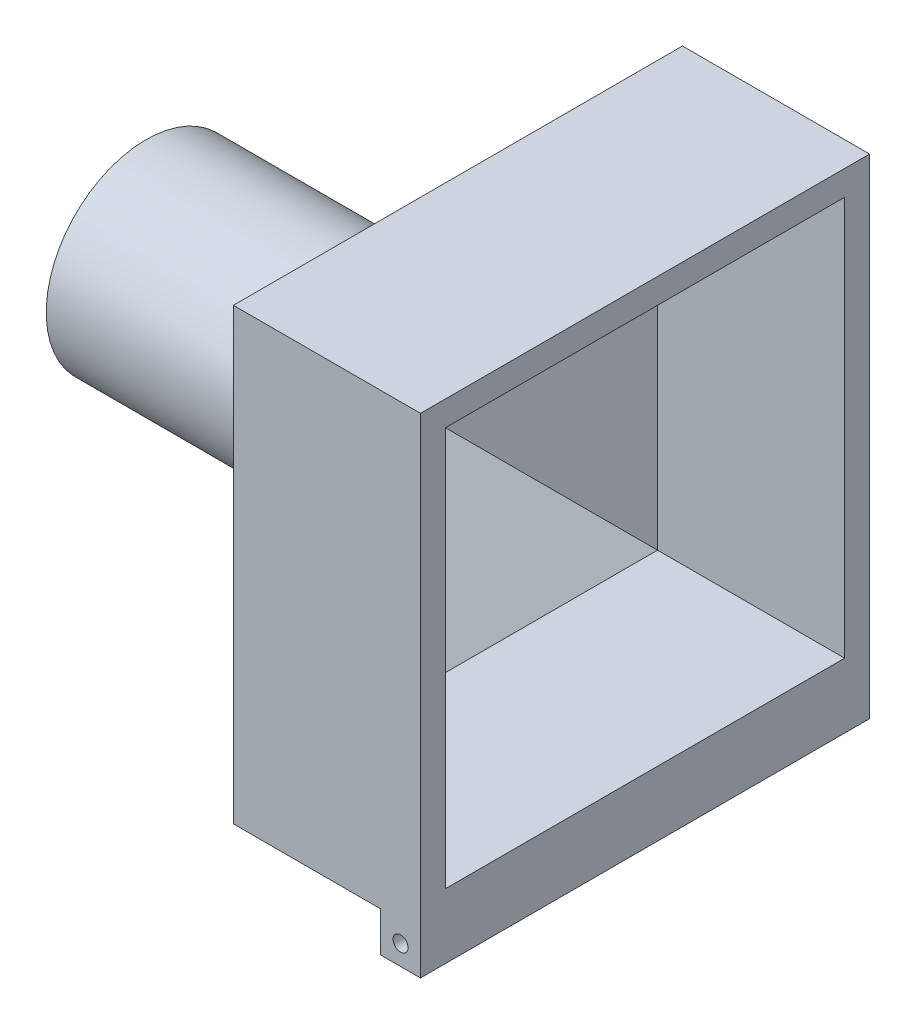
ISO-10303-21;
HEADER;
FILE_DESCRIPTION(('STEP AP214'),'2;1');
FILE_NAME('part.step','',(''),(''),'','','');
FILE_SCHEMA(('AUTOMOTIVE_DESIGN { 1 0 10303 214 1 1 1 1 }'));
ENDSEC;
DATA;
#1=APPLICATION_CONTEXT('core data for automotive mechanical design processes');
#2=APPLICATION_PROTOCOL_DEFINITION('international standard','automotive_design',2000,#1);
#3=PRODUCT_CONTEXT('',#1,'mechanical');
#4=PRODUCT('Part','Part','',(#3));
#5=PRODUCT_RELATED_PRODUCT_CATEGORY('part','',(#4));
#6=PRODUCT_DEFINITION_FORMATION('','',#4);
#7=PRODUCT_DEFINITION_CONTEXT('part definition',#1,'design');
#8=PRODUCT_DEFINITION('design','',#6,#7);
#9=PRODUCT_DEFINITION_SHAPE('','',#8);
#10=(LENGTH_UNIT() NAMED_UNIT(*) SI_UNIT(.MILLI.,.METRE.));
#11=(NAMED_UNIT(*) PLANE_ANGLE_UNIT() SI_UNIT($,.RADIAN.));
#12=(NAMED_UNIT(*) SI_UNIT($,.STERADIAN.) SOLID_ANGLE_UNIT());
#13=UNCERTAINTY_MEASURE_WITH_UNIT(LENGTH_MEASURE(1.E-05),#10,'distance_accuracy_value','');
#14=(GEOMETRIC_REPRESENTATION_CONTEXT(3) GLOBAL_UNCERTAINTY_ASSIGNED_CONTEXT((#13)) GLOBAL_UNIT_ASSIGNED_CONTEXT((#10,
#11,#12)) REPRESENTATION_CONTEXT('',''));
#15=CARTESIAN_POINT('',(0.,0.,0.));
#16=DIRECTION('',(0.,0.,1.));
#17=DIRECTION('',(1.,0.,0.));
#18=AXIS2_PLACEMENT_3D('',#15,#16,#17);
#19=CARTESIAN_POINT('',(40.,-18.,18.));
#20=DIRECTION('',(0.,1.,0.));
#21=DIRECTION('',(0.,0.,1.));
#22=AXIS2_PLACEMENT_3D('',#19,#20,#21);
#23=PLANE('',#22);
#24=DIRECTION('',(0.,0.,-1.));
#25=VECTOR('',#24,1.);
#26=CARTESIAN_POINT('',(36.8,-18.,18.));
#27=LINE('',#26,#25);
#28=CARTESIAN_POINT('',(36.8,-18.,18.));
#29=VERTEX_POINT('',#28);
#30=CARTESIAN_POINT('',(36.8,-18.,-18.));
#31=VERTEX_POINT('',#30);
#32=EDGE_CURVE('E51',#29,#31,#27,.T.);
#33=ORIENTED_EDGE('',*,*,#32,.F.);
#34=DIRECTION('',(-1.,0.,0.));
#35=VECTOR('',#34,1.);
#36=CARTESIAN_POINT('',(40.,-18.,18.));
#37=LINE('',#36,#35);
#38=CARTESIAN_POINT('',(25.,-18.,18.));
#39=VERTEX_POINT('',#38);
#40=EDGE_CURVE('E275',#29,#39,#37,.T.);
#41=ORIENTED_EDGE('',*,*,#40,.T.);
#42=DIRECTION('',(0.,0.,1.));
#43=VECTOR('',#42,1.);
#44=CARTESIAN_POINT('',(25.,-18.,0.));
#45=LINE('',#44,#43);
#46=CARTESIAN_POINT('',(25.,-18.,-18.));
#47=VERTEX_POINT('',#46);
#48=EDGE_CURVE('E309',#39,#47,#45,.F.);
#49=ORIENTED_EDGE('',*,*,#48,.T.);
#50=DIRECTION('',(-1.,0.,0.));
#51=VECTOR('',#50,1.);
#52=CARTESIAN_POINT('',(40.,-18.,-18.));
#53=LINE('',#52,#51);
#54=EDGE_CURVE('E273',#31,#47,#53,.T.);
#55=ORIENTED_EDGE('',*,*,#54,.F.);
#56=EDGE_LOOP('',(#33,#41,#49,#55));
#57=FACE_BOUND('',#56,.T.);
#58=ADVANCED_FACE('F35',(#57),#23,.F.);
#59=CARTESIAN_POINT('',(15.8,0.,0.));
#60=DIRECTION('',(-1.,0.,0.));
#61=DIRECTION('',(0.,0.,1.));
#62=AXIS2_PLACEMENT_3D('',#59,#60,#61);
#63=PLANE('',#62);
#64=DIRECTION('',(0.,-1.,0.));
#65=VECTOR('',#64,1.);
#66=CARTESIAN_POINT('',(15.8,-16.,6.8));
#67=LINE('',#66,#65);
#68=CARTESIAN_POINT('',(15.8,6.8,6.8));
#69=VERTEX_POINT('',#68);
#70=CARTESIAN_POINT('',(15.8,3.39411254969542,6.8));
#71=VERTEX_POINT('',#70);
#72=EDGE_CURVE('E231',#69,#71,#67,.T.);
#73=ORIENTED_EDGE('',*,*,#72,.T.);
#74=CARTESIAN_POINT('',(15.8,0.,0.));
#75=DIRECTION('',(-1.,0.,0.));
#76=DIRECTION('',(0.,0.,1.));
#77=AXIS2_PLACEMENT_3D('',#74,#75,#76);
#78=CIRCLE('',#77,7.6);
#79=CARTESIAN_POINT('',(15.8,6.8,3.39411254969542));
#80=VERTEX_POINT('',#79);
#81=EDGE_CURVE('E11',#71,#80,#78,.T.);
#82=ORIENTED_EDGE('',*,*,#81,.T.);
#83=DIRECTION('',(0.,0.,1.));
#84=VECTOR('',#83,1.);
#85=CARTESIAN_POINT('',(15.8,6.8,16.));
#86=LINE('',#85,#84);
#87=EDGE_CURVE('E227',#80,#69,#86,.T.);
#88=ORIENTED_EDGE('',*,*,#87,.T.);
#89=EDGE_LOOP('',(#73,#82,#88));
#90=FACE_BOUND('',#89,.T.);
#91=ADVANCED_FACE('F372',(#90),#63,.F.);
#92=CARTESIAN_POINT('',(15.8,6.8,-6.8));
#93=VERTEX_POINT('',#92);
#94=CARTESIAN_POINT('',(15.8,6.8,-3.39411254969542));
#95=VERTEX_POINT('',#94);
#96=EDGE_CURVE('E235',#93,#95,#86,.T.);
#97=ORIENTED_EDGE('',*,*,#96,.T.);
#98=CARTESIAN_POINT('',(15.8,3.39411254969542,-6.8));
#99=VERTEX_POINT('',#98);
#100=EDGE_CURVE('E44',#95,#99,#78,.T.);
#101=ORIENTED_EDGE('',*,*,#100,.T.);
#102=DIRECTION('',(0.,1.,0.));
#103=VECTOR('',#102,1.);
#104=CARTESIAN_POINT('',(15.8,-16.,-6.8));
#105=LINE('',#104,#103);
#106=EDGE_CURVE('E212',#99,#93,#105,.T.);
#107=ORIENTED_EDGE('',*,*,#106,.T.);
#108=EDGE_LOOP('',(#97,#101,#107));
#109=FACE_BOUND('',#108,.T.);
#110=ADVANCED_FACE('F377',(#109),#63,.F.);
#111=CARTESIAN_POINT('',(15.8,-6.8,-6.8));
#112=VERTEX_POINT('',#111);
#113=CARTESIAN_POINT('',(15.8,-3.39411254969542,-6.8));
#114=VERTEX_POINT('',#113);
#115=EDGE_CURVE('E224',#112,#114,#105,.T.);
#116=ORIENTED_EDGE('',*,*,#115,.T.);
#117=CARTESIAN_POINT('',(15.8,-6.8,-3.39411254969542));
#118=VERTEX_POINT('',#117);
#119=EDGE_CURVE('E654',#114,#118,#78,.T.);
#120=ORIENTED_EDGE('',*,*,#119,.T.);
#121=DIRECTION('',(0.,0.,-1.));
#122=VECTOR('',#121,1.);
#123=CARTESIAN_POINT('',(15.8,-6.8,16.));
#124=LINE('',#123,#122);
#125=EDGE_CURVE('E230',#118,#112,#124,.T.);
#126=ORIENTED_EDGE('',*,*,#125,.T.);
#127=EDGE_LOOP('',(#116,#120,#126));
#128=FACE_BOUND('',#127,.T.);
#129=ADVANCED_FACE('F369',(#128),#63,.F.);
#130=CARTESIAN_POINT('',(0.,0.,0.));
#131=DIRECTION('',(1.,0.,0.));
#132=DIRECTION('',(0.,0.,-1.));
#133=AXIS2_PLACEMENT_3D('',#130,#131,#132);
#134=PLANE('',#133);
#135=CARTESIAN_POINT('',(0.,0.,0.));
#136=DIRECTION('',(1.,0.,0.));
#137=DIRECTION('',(0.,0.,-1.));
#138=AXIS2_PLACEMENT_3D('',#135,#136,#137);
#139=CIRCLE('',#138,8.);
#140=CARTESIAN_POINT('',(0.,0.,-8.));
#141=VERTEX_POINT('',#140);
#142=EDGE_CURVE('E325',#141,#141,#139,.T.);
#143=ORIENTED_EDGE('',*,*,#142,.F.);
#144=EDGE_LOOP('',(#143));
#145=FACE_BOUND('',#144,.T.);
#146=CARTESIAN_POINT('',(0.,0.,0.));
#147=DIRECTION('',(1.,0.,0.));
#148=DIRECTION('',(0.,0.,-1.));
#149=AXIS2_PLACEMENT_3D('',#146,#147,#148);
#150=CIRCLE('',#149,7.6);
#151=CARTESIAN_POINT('',(0.,0.,-7.6));
#152=VERTEX_POINT('',#151);
#153=EDGE_CURVE('E303',#152,#152,#150,.T.);
#154=ORIENTED_EDGE('',*,*,#153,.T.);
#155=EDGE_LOOP('',(#154));
#156=FACE_BOUND('',#155,.T.);
#157=ADVANCED_FACE('F362',(#145,#156),#134,.F.);
#158=CARTESIAN_POINT('',(15.,0.,0.));
#159=DIRECTION('',(-1.,0.,0.));
#160=DIRECTION('',(0.,0.,1.));
#161=AXIS2_PLACEMENT_3D('',#158,#159,#160);
#162=CYLINDRICAL_SURFACE('',#161,8.);
#163=CARTESIAN_POINT('',(15.,0.,0.));
#164=DIRECTION('',(1.,0.,0.));
#165=DIRECTION('',(0.,0.,-1.));
#166=AXIS2_PLACEMENT_3D('',#163,#164,#165);
#167=CIRCLE('',#166,8.);
#168=CARTESIAN_POINT('',(15.,0.,-8.));
#169=VERTEX_POINT('',#168);
#170=CARTESIAN_POINT('',(15.,8.,0.));
#171=VERTEX_POINT('',#170);
#172=EDGE_CURVE('E326',#169,#171,#167,.T.);
#173=ORIENTED_EDGE('',*,*,#172,.F.);
#174=CARTESIAN_POINT('',(15.,-8.,0.));
#175=VERTEX_POINT('',#174);
#176=EDGE_CURVE('E329',#175,#169,#167,.T.);
#177=ORIENTED_EDGE('',*,*,#176,.F.);
#178=CARTESIAN_POINT('',(15.,0.,8.));
#179=VERTEX_POINT('',#178);
#180=EDGE_CURVE('E334',#179,#175,#167,.T.);
#181=ORIENTED_EDGE('',*,*,#180,.F.);
#182=EDGE_CURVE('E328',#171,#179,#167,.T.);
#183=ORIENTED_EDGE('',*,*,#182,.F.);
#184=EDGE_LOOP('',(#173,#177,#181,#183));
#185=FACE_BOUND('',#184,.T.);
#186=ORIENTED_EDGE('',*,*,#142,.T.);
#187=EDGE_LOOP('',(#186));
#188=FACE_BOUND('',#187,.T.);
#189=ADVANCED_FACE('F37',(#185,#188),#162,.T.);
#190=CARTESIAN_POINT('',(15.,0.,0.));
#191=DIRECTION('',(-1.,0.,0.));
#192=DIRECTION('',(0.,0.,1.));
#193=AXIS2_PLACEMENT_3D('',#190,#191,#192);
#194=CYLINDRICAL_SURFACE('',#193,7.6);
#195=ORIENTED_EDGE('',*,*,#153,.F.);
#196=EDGE_LOOP('',(#195));
#197=FACE_BOUND('',#196,.T.);
#198=CARTESIAN_POINT('',(9.00000000000002,0.,0.));
#199=DIRECTION('',(-0.707106781186549,0.707106781186546,0.));
#200=DIRECTION('',(-0.707106781186546,-0.707106781186549,0.));
#201=AXIS2_PLACEMENT_3D('',#198,#199,#200);
#202=ELLIPSE('',#201,10.7480230740355,7.6);
#203=EDGE_CURVE('E206',#80,#95,#202,.T.);
#204=ORIENTED_EDGE('',*,*,#203,.F.);
#205=ORIENTED_EDGE('',*,*,#81,.F.);
#206=CARTESIAN_POINT('',(9.00000000000002,0.,0.));
#207=DIRECTION('',(-0.707106781186549,0.,0.707106781186546));
#208=DIRECTION('',(-0.707106781186546,0.,-0.707106781186549));
#209=AXIS2_PLACEMENT_3D('',#206,#207,#208);
#210=ELLIPSE('',#209,10.7480230740355,7.6);
#211=CARTESIAN_POINT('',(15.8,-3.39411254969542,6.8));
#212=VERTEX_POINT('',#211);
#213=EDGE_CURVE('E59',#212,#71,#210,.T.);
#214=ORIENTED_EDGE('',*,*,#213,.F.);
#215=CARTESIAN_POINT('',(15.8,-6.8,3.39411254969542));
#216=VERTEX_POINT('',#215);
#217=EDGE_CURVE('E39',#216,#212,#78,.T.);
#218=ORIENTED_EDGE('',*,*,#217,.F.);
#219=CARTESIAN_POINT('',(9.00000000000002,0.,0.));
#220=DIRECTION('',(-0.707106781186549,-0.707106781186546,0.));
#221=DIRECTION('',(-0.707106781186546,0.707106781186549,0.));
#222=AXIS2_PLACEMENT_3D('',#219,#220,#221);
#223=ELLIPSE('',#222,10.7480230740355,7.6);
#224=EDGE_CURVE('E199',#118,#216,#223,.T.);
#225=ORIENTED_EDGE('',*,*,#224,.F.);
#226=ORIENTED_EDGE('',*,*,#119,.F.);
#227=CARTESIAN_POINT('',(9.00000000000002,0.,0.));
#228=DIRECTION('',(-0.707106781186549,0.,-0.707106781186546));
#229=DIRECTION('',(-0.707106781186546,0.,0.707106781186549));
#230=AXIS2_PLACEMENT_3D('',#227,#228,#229);
#231=ELLIPSE('',#230,10.7480230740355,7.6);
#232=EDGE_CURVE('E209',#99,#114,#231,.T.);
#233=ORIENTED_EDGE('',*,*,#232,.F.);
#234=ORIENTED_EDGE('',*,*,#100,.F.);
#235=EDGE_LOOP('',(#204,#205,#214,#218,#225,#226,#233,#234));
#236=FACE_BOUND('',#235,.T.);
#237=ADVANCED_FACE('F361',(#197,#236),#194,.F.);
#238=CARTESIAN_POINT('',(15.,0.,0.));
#239=DIRECTION('',(-1.,0.,0.));
#240=DIRECTION('',(0.,0.,1.));
#241=AXIS2_PLACEMENT_3D('',#238,#239,#240);
#242=PLANE('',#241);
#243=DIRECTION('',(0.,1.,0.));
#244=VECTOR('',#243,1.);
#245=CARTESIAN_POINT('',(15.,-8.,-8.));
#246=LINE('',#245,#244);
#247=CARTESIAN_POINT('',(15.,8.,-8.));
#248=VERTEX_POINT('',#247);
#249=EDGE_CURVE('E283',#169,#248,#246,.T.);
#250=ORIENTED_EDGE('',*,*,#249,.F.);
#251=ORIENTED_EDGE('',*,*,#172,.T.);
#252=DIRECTION('',(0.,0.,1.));
#253=VECTOR('',#252,1.);
#254=CARTESIAN_POINT('',(15.,8.,8.));
#255=LINE('',#254,#253);
#256=EDGE_CURVE('E288',#248,#171,#255,.T.);
#257=ORIENTED_EDGE('',*,*,#256,.F.);
#258=EDGE_LOOP('',(#250,#251,#257));
#259=FACE_BOUND('',#258,.T.);
#260=ADVANCED_FACE('F359',(#259),#242,.T.);
#261=CARTESIAN_POINT('',(15.,8.,8.));
#262=VERTEX_POINT('',#261);
#263=EDGE_CURVE('E287',#171,#262,#255,.T.);
#264=ORIENTED_EDGE('',*,*,#263,.F.);
#265=ORIENTED_EDGE('',*,*,#182,.T.);
#266=DIRECTION('',(0.,-1.,0.));
#267=VECTOR('',#266,1.);
#268=CARTESIAN_POINT('',(15.,-8.,8.));
#269=LINE('',#268,#267);
#270=EDGE_CURVE('E292',#262,#179,#269,.T.);
#271=ORIENTED_EDGE('',*,*,#270,.F.);
#272=EDGE_LOOP('',(#264,#265,#271));
#273=FACE_BOUND('',#272,.T.);
#274=ADVANCED_FACE('F347',(#273),#242,.T.);
#275=CARTESIAN_POINT('',(15.,-8.,8.));
#276=VERTEX_POINT('',#275);
#277=EDGE_CURVE('E291',#179,#276,#269,.T.);
#278=ORIENTED_EDGE('',*,*,#277,.F.);
#279=ORIENTED_EDGE('',*,*,#180,.T.);
#280=DIRECTION('',(0.,0.,-1.));
#281=VECTOR('',#280,1.);
#282=CARTESIAN_POINT('',(15.,-8.,8.));
#283=LINE('',#282,#281);
#284=EDGE_CURVE('E296',#276,#175,#283,.T.);
#285=ORIENTED_EDGE('',*,*,#284,.F.);
#286=EDGE_LOOP('',(#278,#279,#285));
#287=FACE_BOUND('',#286,.T.);
#288=ADVANCED_FACE('F349',(#287),#242,.T.);
#289=CARTESIAN_POINT('',(15.,-8.,-8.));
#290=DIRECTION('',(-0.707106781186549,0.,-0.707106781186546));
#291=DIRECTION('',(-0.707106781186546,0.,0.707106781186549));
#292=AXIS2_PLACEMENT_3D('',#289,#290,#291);
#293=PLANE('',#292);
#294=CARTESIAN_POINT('',(15.,-8.,-8.));
#295=VERTEX_POINT('',#294);
#296=EDGE_CURVE('E284',#295,#169,#246,.T.);
#297=ORIENTED_EDGE('',*,*,#296,.T.);
#298=ORIENTED_EDGE('',*,*,#249,.T.);
#299=DIRECTION('',(-0.577350269189624,-0.577350269189627,0.577350269189627));
#300=VECTOR('',#299,1.);
#301=CARTESIAN_POINT('',(9.66666666666667,2.66666666666665,-2.66666666666665));
#302=LINE('',#301,#300);
#303=CARTESIAN_POINT('',(25.,18.,-18.));
#304=VERTEX_POINT('',#303);
#305=EDGE_CURVE('E300',#304,#248,#302,.T.);
#306=ORIENTED_EDGE('',*,*,#305,.F.);
#307=DIRECTION('',(0.,-1.,0.));
#308=VECTOR('',#307,1.);
#309=CARTESIAN_POINT('',(25.,0.,-18.));
#310=LINE('',#309,#308);
#311=EDGE_CURVE('E299',#47,#304,#310,.F.);
#312=ORIENTED_EDGE('',*,*,#311,.F.);
#313=DIRECTION('',(-0.577350269189624,0.577350269189627,0.577350269189627));
#314=VECTOR('',#313,1.);
#315=CARTESIAN_POINT('',(15.,-8.,-8.));
#316=LINE('',#315,#314);
#317=EDGE_CURVE('E305',#47,#295,#316,.T.);
#318=ORIENTED_EDGE('',*,*,#317,.T.);
#319=EDGE_LOOP('',(#297,#298,#306,#312,#318));
#320=FACE_BOUND('',#319,.T.);
#321=ADVANCED_FACE('F400',(#320),#293,.T.);
#322=CARTESIAN_POINT('',(15.,8.,8.));
#323=DIRECTION('',(-0.707106781186549,0.707106781186546,0.));
#324=DIRECTION('',(-0.707106781186546,-0.707106781186549,0.));
#325=AXIS2_PLACEMENT_3D('',#322,#323,#324);
#326=PLANE('',#325);
#327=ORIENTED_EDGE('',*,*,#256,.T.);
#328=ORIENTED_EDGE('',*,*,#263,.T.);
#329=DIRECTION('',(-0.577350269189624,-0.577350269189627,-0.577350269189627));
#330=VECTOR('',#329,1.);
#331=CARTESIAN_POINT('',(9.66666666666667,2.66666666666665,2.66666666666666));
#332=LINE('',#331,#330);
#333=CARTESIAN_POINT('',(25.,18.,18.));
#334=VERTEX_POINT('',#333);
#335=EDGE_CURVE('E304',#334,#262,#332,.T.);
#336=ORIENTED_EDGE('',*,*,#335,.F.);
#337=DIRECTION('',(0.,0.,-1.));
#338=VECTOR('',#337,1.);
#339=CARTESIAN_POINT('',(25.,18.,0.));
#340=LINE('',#339,#338);
#341=EDGE_CURVE('E315',#304,#334,#340,.F.);
#342=ORIENTED_EDGE('',*,*,#341,.F.);
#343=ORIENTED_EDGE('',*,*,#305,.T.);
#344=EDGE_LOOP('',(#327,#328,#336,#342,#343));
#345=FACE_BOUND('',#344,.T.);
#346=ADVANCED_FACE('F355',(#345),#326,.T.);
#347=CARTESIAN_POINT('',(15.,-8.,8.));
#348=DIRECTION('',(-0.707106781186549,0.,0.707106781186546));
#349=DIRECTION('',(0.707106781186546,0.,0.707106781186549));
#350=AXIS2_PLACEMENT_3D('',#347,#348,#349);
#351=PLANE('',#350);
#352=ORIENTED_EDGE('',*,*,#270,.T.);
#353=ORIENTED_EDGE('',*,*,#277,.T.);
#354=DIRECTION('',(-0.577350269189624,0.577350269189627,-0.577350269189627));
#355=VECTOR('',#354,1.);
#356=CARTESIAN_POINT('',(15.,-8.,8.));
#357=LINE('',#356,#355);
#358=EDGE_CURVE('E308',#39,#276,#357,.T.);
#359=ORIENTED_EDGE('',*,*,#358,.F.);
#360=DIRECTION('',(0.,1.,0.));
#361=VECTOR('',#360,1.);
#362=CARTESIAN_POINT('',(25.,0.,18.));
#363=LINE('',#362,#361);
#364=EDGE_CURVE('E318',#334,#39,#363,.F.);
#365=ORIENTED_EDGE('',*,*,#364,.F.);
#366=ORIENTED_EDGE('',*,*,#335,.T.);
#367=EDGE_LOOP('',(#352,#353,#359,#365,#366));
#368=FACE_BOUND('',#367,.T.);
#369=ADVANCED_FACE('F352',(#368),#351,.T.);
#370=CARTESIAN_POINT('',(15.,-8.,8.));
#371=DIRECTION('',(-0.707106781186549,-0.707106781186546,0.));
#372=DIRECTION('',(0.707106781186546,-0.707106781186549,0.));
#373=AXIS2_PLACEMENT_3D('',#370,#371,#372);
#374=PLANE('',#373);
#375=ORIENTED_EDGE('',*,*,#284,.T.);
#376=EDGE_CURVE('E295',#175,#295,#283,.T.);
#377=ORIENTED_EDGE('',*,*,#376,.T.);
#378=ORIENTED_EDGE('',*,*,#317,.F.);
#379=ORIENTED_EDGE('',*,*,#48,.F.);
#380=ORIENTED_EDGE('',*,*,#358,.T.);
#381=EDGE_LOOP('',(#375,#377,#378,#379,#380));
#382=FACE_BOUND('',#381,.T.);
#383=ADVANCED_FACE('F399',(#382),#374,.T.);
#384=ORIENTED_EDGE('',*,*,#376,.F.);
#385=ORIENTED_EDGE('',*,*,#176,.T.);
#386=ORIENTED_EDGE('',*,*,#296,.F.);
#387=EDGE_LOOP('',(#384,#385,#386));
#388=FACE_BOUND('',#387,.T.);
#389=ADVANCED_FACE('F395',(#388),#242,.T.);
#390=CARTESIAN_POINT('',(40.,-18.,-18.));
#391=DIRECTION('',(0.,0.,1.));
#392=DIRECTION('',(1.,0.,0.));
#393=AXIS2_PLACEMENT_3D('',#390,#391,#392);
#394=PLANE('',#393);
#395=CARTESIAN_POINT('',(38.4,-19.6,-18.));
#396=DIRECTION('',(0.,0.,-1.));
#397=DIRECTION('',(-1.,0.,0.));
#398=AXIS2_PLACEMENT_3D('',#395,#396,#397);
#399=CIRCLE('',#398,0.6);
#400=CARTESIAN_POINT('',(37.8,-19.6,-18.));
#401=VERTEX_POINT('',#400);
#402=EDGE_CURVE('E688',#401,#401,#399,.T.);
#403=ORIENTED_EDGE('',*,*,#402,.F.);
#404=EDGE_LOOP('',(#403));
#405=FACE_BOUND('',#404,.T.);
#406=ORIENTED_EDGE('',*,*,#311,.T.);
#407=DIRECTION('',(-1.,0.,0.));
#408=VECTOR('',#407,1.);
#409=CARTESIAN_POINT('',(40.,18.,-18.));
#410=LINE('',#409,#408);
#411=CARTESIAN_POINT('',(40.,18.,-18.));
#412=VERTEX_POINT('',#411);
#413=EDGE_CURVE('E280',#412,#304,#410,.T.);
#414=ORIENTED_EDGE('',*,*,#413,.F.);
#415=DIRECTION('',(0.,1.,0.));
#416=VECTOR('',#415,1.);
#417=CARTESIAN_POINT('',(40.,-18.,-18.));
#418=LINE('',#417,#416);
#419=CARTESIAN_POINT('',(40.,-21.2,-18.));
#420=VERTEX_POINT('',#419);
#421=EDGE_CURVE('E181',#420,#412,#418,.T.);
#422=ORIENTED_EDGE('',*,*,#421,.F.);
#423=DIRECTION('',(1.,0.,0.));
#424=VECTOR('',#423,1.);
#425=CARTESIAN_POINT('',(36.8,-21.2,-18.));
#426=LINE('',#425,#424);
#427=CARTESIAN_POINT('',(36.8,-21.2,-18.));
#428=VERTEX_POINT('',#427);
#429=EDGE_CURVE('E173',#428,#420,#426,.T.);
#430=ORIENTED_EDGE('',*,*,#429,.F.);
#431=DIRECTION('',(0.,1.,0.));
#432=VECTOR('',#431,1.);
#433=CARTESIAN_POINT('',(36.8,-21.2,-18.));
#434=LINE('',#433,#432);
#435=EDGE_CURVE('E178',#428,#31,#434,.T.);
#436=ORIENTED_EDGE('',*,*,#435,.T.);
#437=ORIENTED_EDGE('',*,*,#54,.T.);
#438=EDGE_LOOP('',(#406,#414,#422,#430,#436,#437));
#439=FACE_BOUND('',#438,.T.);
#440=ADVANCED_FACE('F176',(#405,#439),#394,.F.);
#441=CARTESIAN_POINT('',(40.,18.,18.));
#442=DIRECTION('',(0.,-1.,0.));
#443=DIRECTION('',(0.,0.,-1.));
#444=AXIS2_PLACEMENT_3D('',#441,#442,#443);
#445=PLANE('',#444);
#446=ORIENTED_EDGE('',*,*,#341,.T.);
#447=DIRECTION('',(-1.,0.,0.));
#448=VECTOR('',#447,1.);
#449=CARTESIAN_POINT('',(40.,18.,18.));
#450=LINE('',#449,#448);
#451=CARTESIAN_POINT('',(40.,18.,18.));
#452=VERTEX_POINT('',#451);
#453=EDGE_CURVE('E277',#452,#334,#450,.T.);
#454=ORIENTED_EDGE('',*,*,#453,.F.);
#455=DIRECTION('',(0.,0.,1.));
#456=VECTOR('',#455,1.);
#457=CARTESIAN_POINT('',(40.,18.,18.));
#458=LINE('',#457,#456);
#459=EDGE_CURVE('E269',#412,#452,#458,.T.);
#460=ORIENTED_EDGE('',*,*,#459,.F.);
#461=ORIENTED_EDGE('',*,*,#413,.T.);
#462=EDGE_LOOP('',(#446,#454,#460,#461));
#463=FACE_BOUND('',#462,.T.);
#464=ADVANCED_FACE('F388',(#463),#445,.F.);
#465=CARTESIAN_POINT('',(40.,-18.,18.));
#466=DIRECTION('',(0.,0.,-1.));
#467=DIRECTION('',(-1.,0.,0.));
#468=AXIS2_PLACEMENT_3D('',#465,#466,#467);
#469=PLANE('',#468);
#470=CARTESIAN_POINT('',(38.4,-19.6,18.));
#471=DIRECTION('',(0.,0.,-1.));
#472=DIRECTION('',(-1.,0.,0.));
#473=AXIS2_PLACEMENT_3D('',#470,#471,#472);
#474=CIRCLE('',#473,0.6);
#475=CARTESIAN_POINT('',(37.8,-19.6,18.));
#476=VERTEX_POINT('',#475);
#477=EDGE_CURVE('E686',#476,#476,#474,.F.);
#478=ORIENTED_EDGE('',*,*,#477,.F.);
#479=EDGE_LOOP('',(#478));
#480=FACE_BOUND('',#479,.T.);
#481=ORIENTED_EDGE('',*,*,#364,.T.);
#482=ORIENTED_EDGE('',*,*,#40,.F.);
#483=DIRECTION('',(0.,1.,0.));
#484=VECTOR('',#483,1.);
#485=CARTESIAN_POINT('',(36.8,-21.2,18.));
#486=LINE('',#485,#484);
#487=CARTESIAN_POINT('',(36.8,-21.2,18.));
#488=VERTEX_POINT('',#487);
#489=EDGE_CURVE('E197',#488,#29,#486,.T.);
#490=ORIENTED_EDGE('',*,*,#489,.F.);
#491=DIRECTION('',(-1.,0.,0.));
#492=VECTOR('',#491,1.);
#493=CARTESIAN_POINT('',(36.8,-21.2,18.));
#494=LINE('',#493,#492);
#495=CARTESIAN_POINT('',(40.,-21.2,18.));
#496=VERTEX_POINT('',#495);
#497=EDGE_CURVE('E191',#496,#488,#494,.T.);
#498=ORIENTED_EDGE('',*,*,#497,.F.);
#499=DIRECTION('',(0.,-1.,0.));
#500=VECTOR('',#499,1.);
#501=CARTESIAN_POINT('',(40.,-18.,18.));
#502=LINE('',#501,#500);
#503=EDGE_CURVE('E271',#452,#496,#502,.T.);
#504=ORIENTED_EDGE('',*,*,#503,.F.);
#505=ORIENTED_EDGE('',*,*,#453,.T.);
#506=EDGE_LOOP('',(#481,#482,#490,#498,#504,#505));
#507=FACE_BOUND('',#506,.T.);
#508=ADVANCED_FACE('F385',(#480,#507),#469,.F.);
#509=CARTESIAN_POINT('',(40.,0.,0.));
#510=DIRECTION('',(-1.,0.,0.));
#511=DIRECTION('',(0.,0.,1.));
#512=AXIS2_PLACEMENT_3D('',#509,#510,#511);
#513=PLANE('',#512);
#514=DIRECTION('',(0.,0.,1.));
#515=VECTOR('',#514,1.);
#516=CARTESIAN_POINT('',(40.,16.,16.));
#517=LINE('',#516,#515);
#518=CARTESIAN_POINT('',(40.,16.,-16.));
#519=VERTEX_POINT('',#518);
#520=CARTESIAN_POINT('',(40.,16.,16.));
#521=VERTEX_POINT('',#520);
#522=EDGE_CURVE('E252',#519,#521,#517,.T.);
#523=ORIENTED_EDGE('',*,*,#522,.F.);
#524=DIRECTION('',(0.,1.,0.));
#525=VECTOR('',#524,1.);
#526=CARTESIAN_POINT('',(40.,-16.,-16.));
#527=LINE('',#526,#525);
#528=CARTESIAN_POINT('',(40.,-16.,-16.));
#529=VERTEX_POINT('',#528);
#530=EDGE_CURVE('E215',#529,#519,#527,.T.);
#531=ORIENTED_EDGE('',*,*,#530,.F.);
#532=DIRECTION('',(0.,0.,-1.));
#533=VECTOR('',#532,1.);
#534=CARTESIAN_POINT('',(40.,-16.,16.));
#535=LINE('',#534,#533);
#536=CARTESIAN_POINT('',(40.,-16.,16.));
#537=VERTEX_POINT('',#536);
#538=EDGE_CURVE('E242',#537,#529,#535,.T.);
#539=ORIENTED_EDGE('',*,*,#538,.F.);
#540=DIRECTION('',(0.,-1.,0.));
#541=VECTOR('',#540,1.);
#542=CARTESIAN_POINT('',(40.,-16.,16.));
#543=LINE('',#542,#541);
#544=EDGE_CURVE('E255',#521,#537,#543,.T.);
#545=ORIENTED_EDGE('',*,*,#544,.F.);
#546=EDGE_LOOP('',(#523,#531,#539,#545));
#547=FACE_BOUND('',#546,.T.);
#548=ORIENTED_EDGE('',*,*,#421,.T.);
#549=ORIENTED_EDGE('',*,*,#459,.T.);
#550=ORIENTED_EDGE('',*,*,#503,.T.);
#551=DIRECTION('',(0.,0.,1.));
#552=VECTOR('',#551,1.);
#553=CARTESIAN_POINT('',(40.,-21.2,18.));
#554=LINE('',#553,#552);
#555=EDGE_CURVE('E185',#420,#496,#554,.T.);
#556=ORIENTED_EDGE('',*,*,#555,.F.);
#557=EDGE_LOOP('',(#548,#549,#550,#556));
#558=FACE_BOUND('',#557,.T.);
#559=ADVANCED_FACE('F383',(#547,#558),#513,.F.);
#560=CARTESIAN_POINT('',(25.,-16.,-16.));
#561=DIRECTION('',(0.,0.,-1.));
#562=DIRECTION('',(-1.,0.,0.));
#563=AXIS2_PLACEMENT_3D('',#560,#561,#562);
#564=PLANE('',#563);
#565=ORIENTED_EDGE('',*,*,#530,.T.);
#566=DIRECTION('',(1.,0.,0.));
#567=VECTOR('',#566,1.);
#568=CARTESIAN_POINT('',(25.,16.,-16.));
#569=LINE('',#568,#567);
#570=CARTESIAN_POINT('',(25.,16.,-16.));
#571=VERTEX_POINT('',#570);
#572=EDGE_CURVE('E250',#571,#519,#569,.T.);
#573=ORIENTED_EDGE('',*,*,#572,.F.);
#574=DIRECTION('',(0.,1.,0.));
#575=VECTOR('',#574,1.);
#576=CARTESIAN_POINT('',(25.,-16.,-16.));
#577=LINE('',#576,#575);
#578=CARTESIAN_POINT('',(25.,-16.,-16.));
#579=VERTEX_POINT('',#578);
#580=EDGE_CURVE('E238',#579,#571,#577,.T.);
#581=ORIENTED_EDGE('',*,*,#580,.F.);
#582=DIRECTION('',(1.,0.,0.));
#583=VECTOR('',#582,1.);
#584=CARTESIAN_POINT('',(25.,-16.,-16.));
#585=LINE('',#584,#583);
#586=EDGE_CURVE('E260',#579,#529,#585,.T.);
#587=ORIENTED_EDGE('',*,*,#586,.T.);
#588=EDGE_LOOP('',(#565,#573,#581,#587));
#589=FACE_BOUND('',#588,.T.);
#590=ADVANCED_FACE('F449',(#589),#564,.F.);
#591=CARTESIAN_POINT('',(25.,-16.,16.));
#592=DIRECTION('',(0.,-1.,0.));
#593=DIRECTION('',(0.,0.,-1.));
#594=AXIS2_PLACEMENT_3D('',#591,#592,#593);
#595=PLANE('',#594);
#596=ORIENTED_EDGE('',*,*,#538,.T.);
#597=ORIENTED_EDGE('',*,*,#586,.F.);
#598=DIRECTION('',(0.,0.,-1.));
#599=VECTOR('',#598,1.);
#600=CARTESIAN_POINT('',(25.,-16.,16.));
#601=LINE('',#600,#599);
#602=CARTESIAN_POINT('',(25.,-16.,16.));
#603=VERTEX_POINT('',#602);
#604=EDGE_CURVE('E247',#603,#579,#601,.T.);
#605=ORIENTED_EDGE('',*,*,#604,.F.);
#606=DIRECTION('',(1.,0.,0.));
#607=VECTOR('',#606,1.);
#608=CARTESIAN_POINT('',(25.,-16.,16.));
#609=LINE('',#608,#607);
#610=EDGE_CURVE('E262',#603,#537,#609,.T.);
#611=ORIENTED_EDGE('',*,*,#610,.T.);
#612=EDGE_LOOP('',(#596,#597,#605,#611));
#613=FACE_BOUND('',#612,.T.);
#614=ADVANCED_FACE('F456',(#613),#595,.F.);
#615=CARTESIAN_POINT('',(25.,-16.,16.));
#616=DIRECTION('',(0.,0.,1.));
#617=DIRECTION('',(1.,0.,0.));
#618=AXIS2_PLACEMENT_3D('',#615,#616,#617);
#619=PLANE('',#618);
#620=ORIENTED_EDGE('',*,*,#544,.T.);
#621=ORIENTED_EDGE('',*,*,#610,.F.);
#622=DIRECTION('',(0.,-1.,0.));
#623=VECTOR('',#622,1.);
#624=CARTESIAN_POINT('',(25.,-16.,16.));
#625=LINE('',#624,#623);
#626=CARTESIAN_POINT('',(25.,16.,16.));
#627=VERTEX_POINT('',#626);
#628=EDGE_CURVE('E245',#627,#603,#625,.T.);
#629=ORIENTED_EDGE('',*,*,#628,.F.);
#630=DIRECTION('',(1.,0.,0.));
#631=VECTOR('',#630,1.);
#632=CARTESIAN_POINT('',(25.,16.,16.));
#633=LINE('',#632,#631);
#634=EDGE_CURVE('E264',#627,#521,#633,.T.);
#635=ORIENTED_EDGE('',*,*,#634,.T.);
#636=EDGE_LOOP('',(#620,#621,#629,#635));
#637=FACE_BOUND('',#636,.T.);
#638=ADVANCED_FACE('F463',(#637),#619,.F.);
#639=CARTESIAN_POINT('',(25.,16.,16.));
#640=DIRECTION('',(0.,1.,0.));
#641=DIRECTION('',(0.,0.,1.));
#642=AXIS2_PLACEMENT_3D('',#639,#640,#641);
#643=PLANE('',#642);
#644=ORIENTED_EDGE('',*,*,#522,.T.);
#645=ORIENTED_EDGE('',*,*,#634,.F.);
#646=DIRECTION('',(0.,0.,1.));
#647=VECTOR('',#646,1.);
#648=CARTESIAN_POINT('',(25.,16.,16.));
#649=LINE('',#648,#647);
#650=EDGE_CURVE('E241',#571,#627,#649,.T.);
#651=ORIENTED_EDGE('',*,*,#650,.F.);
#652=ORIENTED_EDGE('',*,*,#572,.T.);
#653=EDGE_LOOP('',(#644,#645,#651,#652));
#654=FACE_BOUND('',#653,.T.);
#655=ADVANCED_FACE('F471',(#654),#643,.F.);
#656=CARTESIAN_POINT('',(25.,-16.,-16.));
#657=DIRECTION('',(-0.707106781186549,0.,-0.707106781186546));
#658=DIRECTION('',(-0.707106781186546,0.,0.707106781186549));
#659=AXIS2_PLACEMENT_3D('',#656,#657,#658);
#660=PLANE('',#659);
#661=ORIENTED_EDGE('',*,*,#106,.F.);
#662=ORIENTED_EDGE('',*,*,#232,.T.);
#663=ORIENTED_EDGE('',*,*,#115,.F.);
#664=DIRECTION('',(0.577350269189624,-0.577350269189627,-0.577350269189627));
#665=VECTOR('',#664,1.);
#666=CARTESIAN_POINT('',(14.3333333333333,-5.33333333333332,-5.33333333333332));
#667=LINE('',#666,#665);
#668=EDGE_CURVE('E213',#112,#579,#667,.T.);
#669=ORIENTED_EDGE('',*,*,#668,.T.);
#670=ORIENTED_EDGE('',*,*,#580,.T.);
#671=DIRECTION('',(0.577350269189624,0.577350269189627,-0.577350269189627));
#672=VECTOR('',#671,1.);
#673=CARTESIAN_POINT('',(14.3333333333333,5.33333333333332,-5.33333333333332));
#674=LINE('',#673,#672);
#675=EDGE_CURVE('E217',#93,#571,#674,.T.);
#676=ORIENTED_EDGE('',*,*,#675,.F.);
#677=EDGE_LOOP('',(#661,#662,#663,#669,#670,#676));
#678=FACE_BOUND('',#677,.T.);
#679=ADVANCED_FACE('F479',(#678),#660,.F.);
#680=CARTESIAN_POINT('',(25.,-16.,16.));
#681=DIRECTION('',(-0.707106781186549,-0.707106781186546,0.));
#682=DIRECTION('',(0.707106781186546,-0.707106781186549,0.));
#683=AXIS2_PLACEMENT_3D('',#680,#681,#682);
#684=PLANE('',#683);
#685=ORIENTED_EDGE('',*,*,#125,.F.);
#686=ORIENTED_EDGE('',*,*,#224,.T.);
#687=CARTESIAN_POINT('',(15.8,-6.8,6.8));
#688=VERTEX_POINT('',#687);
#689=EDGE_CURVE('E220',#688,#216,#124,.T.);
#690=ORIENTED_EDGE('',*,*,#689,.F.);
#691=DIRECTION('',(0.577350269189624,-0.577350269189627,0.577350269189627));
#692=VECTOR('',#691,1.);
#693=CARTESIAN_POINT('',(25.,-16.,16.));
#694=LINE('',#693,#692);
#695=EDGE_CURVE('E216',#688,#603,#694,.T.);
#696=ORIENTED_EDGE('',*,*,#695,.T.);
#697=ORIENTED_EDGE('',*,*,#604,.T.);
#698=ORIENTED_EDGE('',*,*,#668,.F.);
#699=EDGE_LOOP('',(#685,#686,#690,#696,#697,#698));
#700=FACE_BOUND('',#699,.T.);
#701=ADVANCED_FACE('F488',(#700),#684,.F.);
#702=CARTESIAN_POINT('',(25.,-16.,16.));
#703=DIRECTION('',(-0.707106781186549,0.,0.707106781186546));
#704=DIRECTION('',(0.707106781186546,0.,0.707106781186549));
#705=AXIS2_PLACEMENT_3D('',#702,#703,#704);
#706=PLANE('',#705);
#707=EDGE_CURVE('E234',#212,#688,#67,.T.);
#708=ORIENTED_EDGE('',*,*,#707,.F.);
#709=ORIENTED_EDGE('',*,*,#213,.T.);
#710=ORIENTED_EDGE('',*,*,#72,.F.);
#711=DIRECTION('',(0.577350269189624,0.577350269189627,0.577350269189627));
#712=VECTOR('',#711,1.);
#713=CARTESIAN_POINT('',(25.,16.,16.));
#714=LINE('',#713,#712);
#715=EDGE_CURVE('E219',#69,#627,#714,.T.);
#716=ORIENTED_EDGE('',*,*,#715,.T.);
#717=ORIENTED_EDGE('',*,*,#628,.T.);
#718=ORIENTED_EDGE('',*,*,#695,.F.);
#719=EDGE_LOOP('',(#708,#709,#710,#716,#717,#718));
#720=FACE_BOUND('',#719,.T.);
#721=ADVANCED_FACE('F497',(#720),#706,.F.);
#722=CARTESIAN_POINT('',(25.,16.,16.));
#723=DIRECTION('',(-0.707106781186549,0.707106781186546,0.));
#724=DIRECTION('',(-0.707106781186546,-0.707106781186549,0.));
#725=AXIS2_PLACEMENT_3D('',#722,#723,#724);
#726=PLANE('',#725);
#727=ORIENTED_EDGE('',*,*,#87,.F.);
#728=ORIENTED_EDGE('',*,*,#203,.T.);
#729=ORIENTED_EDGE('',*,*,#96,.F.);
#730=ORIENTED_EDGE('',*,*,#675,.T.);
#731=ORIENTED_EDGE('',*,*,#650,.T.);
#732=ORIENTED_EDGE('',*,*,#715,.F.);
#733=EDGE_LOOP('',(#727,#728,#729,#730,#731,#732));
#734=FACE_BOUND('',#733,.T.);
#735=ADVANCED_FACE('F505',(#734),#726,.F.);
#736=ORIENTED_EDGE('',*,*,#689,.T.);
#737=ORIENTED_EDGE('',*,*,#217,.T.);
#738=ORIENTED_EDGE('',*,*,#707,.T.);
#739=EDGE_LOOP('',(#736,#737,#738));
#740=FACE_BOUND('',#739,.T.);
#741=ADVANCED_FACE('F380',(#740),#63,.F.);
#742=CARTESIAN_POINT('',(36.8,-21.2,18.));
#743=DIRECTION('',(1.,0.,0.));
#744=DIRECTION('',(0.,0.,-1.));
#745=AXIS2_PLACEMENT_3D('',#742,#743,#744);
#746=PLANE('',#745);
#747=ORIENTED_EDGE('',*,*,#32,.T.);
#748=ORIENTED_EDGE('',*,*,#435,.F.);
#749=DIRECTION('',(0.,0.,-1.));
#750=VECTOR('',#749,1.);
#751=CARTESIAN_POINT('',(36.8,-21.2,18.));
#752=LINE('',#751,#750);
#753=EDGE_CURVE('E186',#488,#428,#752,.T.);
#754=ORIENTED_EDGE('',*,*,#753,.F.);
#755=ORIENTED_EDGE('',*,*,#489,.T.);
#756=EDGE_LOOP('',(#747,#748,#754,#755));
#757=FACE_BOUND('',#756,.T.);
#758=ADVANCED_FACE('F196',(#757),#746,.F.);
#759=CARTESIAN_POINT('',(0.,-21.2,0.));
#760=DIRECTION('',(0.,-1.,0.));
#761=DIRECTION('',(0.,0.,-1.));
#762=AXIS2_PLACEMENT_3D('',#759,#760,#761);
#763=PLANE('',#762);
#764=ORIENTED_EDGE('',*,*,#753,.T.);
#765=ORIENTED_EDGE('',*,*,#429,.T.);
#766=ORIENTED_EDGE('',*,*,#555,.T.);
#767=ORIENTED_EDGE('',*,*,#497,.T.);
#768=EDGE_LOOP('',(#764,#765,#766,#767));
#769=FACE_BOUND('',#768,.T.);
#770=ADVANCED_FACE('F189',(#769),#763,.T.);
#771=CARTESIAN_POINT('',(38.4,-19.6,19.6970562748478));
#772=DIRECTION('',(0.,0.,-1.));
#773=DIRECTION('',(-1.,0.,0.));
#774=AXIS2_PLACEMENT_3D('',#771,#772,#773);
#775=CYLINDRICAL_SURFACE('',#774,0.6);
#776=ORIENTED_EDGE('',*,*,#477,.T.);
#777=EDGE_LOOP('',(#776));
#778=FACE_BOUND('',#777,.T.);
#779=ORIENTED_EDGE('',*,*,#402,.T.);
#780=EDGE_LOOP('',(#779));
#781=FACE_BOUND('',#780,.T.);
#782=ADVANCED_FACE('F530',(#778,#781),#775,.F.);
#783=CLOSED_SHELL('',(#58,#91,#110,#129,#157,#189,#237,#260,#274,#288,#321,#346,#369,#383,#389,
#440,#464,#508,#559,#590,#614,#638,#655,#679,#701,#721,#735,#741,#758,#770,#782));
#784=MANIFOLD_SOLID_BREP('B2',#783);
#785=ADVANCED_BREP_SHAPE_REPRESENTATION('',(#18,#784),#14);
#786=SHAPE_DEFINITION_REPRESENTATION(#9,#785);
ENDSEC;
END-ISO-10303-21;
